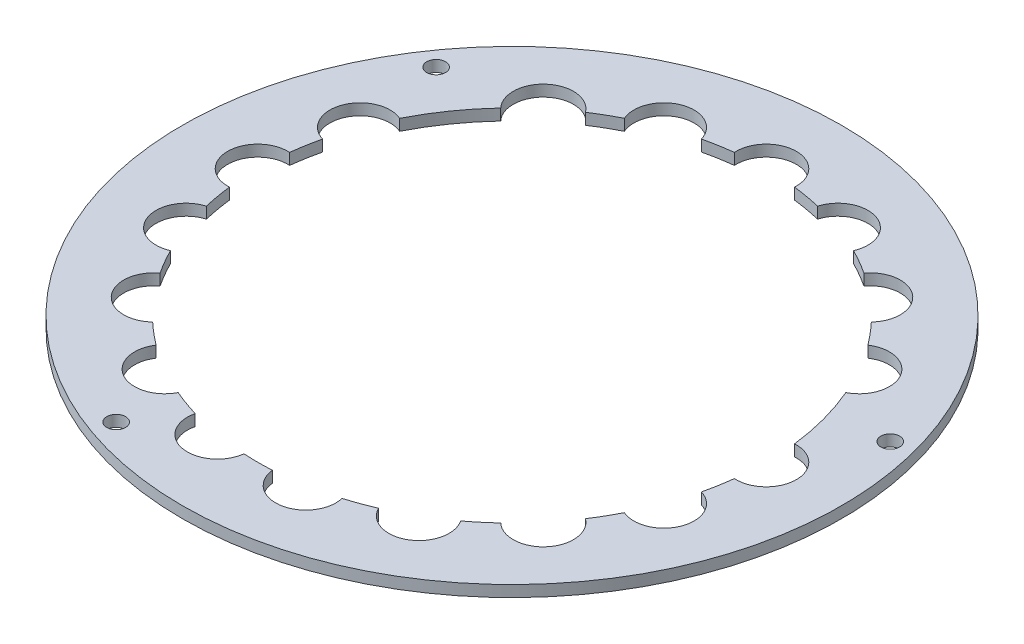
ISO-10303-21;
HEADER;
FILE_DESCRIPTION(('STEP AP214'),'2;1');
FILE_NAME('part.step','',(''),(''),'','','');
FILE_SCHEMA(('AUTOMOTIVE_DESIGN { 1 0 10303 214 1 1 1 1 }'));
ENDSEC;
DATA;
#1=APPLICATION_CONTEXT('core data for automotive mechanical design processes');
#2=APPLICATION_PROTOCOL_DEFINITION('international standard','automotive_design',2000,#1);
#3=PRODUCT_CONTEXT('',#1,'mechanical');
#4=PRODUCT('Part','Part','',(#3));
#5=PRODUCT_RELATED_PRODUCT_CATEGORY('part','',(#4));
#6=PRODUCT_DEFINITION_FORMATION('','',#4);
#7=PRODUCT_DEFINITION_CONTEXT('part definition',#1,'design');
#8=PRODUCT_DEFINITION('design','',#6,#7);
#9=PRODUCT_DEFINITION_SHAPE('','',#8);
#10=(LENGTH_UNIT() NAMED_UNIT(*) SI_UNIT(.MILLI.,.METRE.));
#11=(NAMED_UNIT(*) PLANE_ANGLE_UNIT() SI_UNIT($,.RADIAN.));
#12=(NAMED_UNIT(*) SI_UNIT($,.STERADIAN.) SOLID_ANGLE_UNIT());
#13=UNCERTAINTY_MEASURE_WITH_UNIT(LENGTH_MEASURE(1.E-05),#10,'distance_accuracy_value','');
#14=(GEOMETRIC_REPRESENTATION_CONTEXT(3) GLOBAL_UNCERTAINTY_ASSIGNED_CONTEXT((#13)) GLOBAL_UNIT_ASSIGNED_CONTEXT((#10,
#11,#12)) REPRESENTATION_CONTEXT('',''));
#15=CARTESIAN_POINT('',(0.,0.,0.));
#16=DIRECTION('',(0.,0.,1.));
#17=DIRECTION('',(1.,0.,0.));
#18=AXIS2_PLACEMENT_3D('',#15,#16,#17);
#19=CARTESIAN_POINT('',(0.,-0.00100000000000002,0.));
#20=DIRECTION('',(0.,1.,0.));
#21=DIRECTION('',(0.,0.,1.));
#22=AXIS2_PLACEMENT_3D('',#19,#20,#21);
#23=CYLINDRICAL_SURFACE('',#22,13.5);
#24=CARTESIAN_POINT('',(0.,0.,0.));
#25=DIRECTION('',(0.,1.,0.));
#26=DIRECTION('',(0.,0.,1.));
#27=AXIS2_PLACEMENT_3D('',#24,#25,#26);
#28=CIRCLE('',#27,13.5);
#29=CARTESIAN_POINT('',(-13.4051851851852,0.,-1.59718820146269));
#30=VERTEX_POINT('',#29);
#31=CARTESIAN_POINT('',(-13.1430241363694,0.,-3.08397739142346));
#32=VERTEX_POINT('',#31);
#33=EDGE_CURVE('E269',#30,#32,#28,.F.);
#34=ORIENTED_EDGE('',*,*,#33,.T.);
#35=DIRECTION('',(0.,1.,0.));
#36=VECTOR('',#35,1.);
#37=CARTESIAN_POINT('',(-13.1430241363694,0.3,-3.08397739142346));
#38=LINE('',#37,#36);
#39=CARTESIAN_POINT('',(-13.1430241363694,0.6,-3.08397739142346));
#40=VERTEX_POINT('',#39);
#41=EDGE_CURVE('E49',#40,#32,#38,.F.);
#42=ORIENTED_EDGE('',*,*,#41,.F.);
#43=CARTESIAN_POINT('',(0.,0.6,0.));
#44=DIRECTION('',(0.,1.,0.));
#45=DIRECTION('',(0.,0.,1.));
#46=AXIS2_PLACEMENT_3D('',#43,#44,#45);
#47=CIRCLE('',#46,13.5);
#48=CARTESIAN_POINT('',(-13.4051851851852,0.6,-1.5971882014627));
#49=VERTEX_POINT('',#48);
#50=EDGE_CURVE('E266',#40,#49,#47,.T.);
#51=ORIENTED_EDGE('',*,*,#50,.T.);
#52=DIRECTION('',(0.,1.,0.));
#53=VECTOR('',#52,1.);
#54=CARTESIAN_POINT('',(-13.4051851851852,0.3,-1.5971882014627));
#55=LINE('',#54,#53);
#56=EDGE_CURVE('E553',#30,#49,#55,.T.);
#57=ORIENTED_EDGE('',*,*,#56,.F.);
#58=EDGE_LOOP('',(#34,#42,#51,#57));
#59=FACE_BOUND('',#58,.T.);
#60=ADVANCED_FACE('F34',(#59),#23,.F.);
#61=CARTESIAN_POINT('',(-13.1430241363695,0.,3.08397739142328));
#62=VERTEX_POINT('',#61);
#63=CARTESIAN_POINT('',(-13.4051851851852,0.,1.59718820146269));
#64=VERTEX_POINT('',#63);
#65=EDGE_CURVE('E540',#62,#64,#28,.F.);
#66=ORIENTED_EDGE('',*,*,#65,.T.);
#67=DIRECTION('',(0.,1.,0.));
#68=VECTOR('',#67,1.);
#69=CARTESIAN_POINT('',(-13.4051851851852,0.3,1.5971882014627));
#70=LINE('',#69,#68);
#71=CARTESIAN_POINT('',(-13.4051851851852,0.6,1.5971882014627));
#72=VERTEX_POINT('',#71);
#73=EDGE_CURVE('E57',#72,#64,#70,.F.);
#74=ORIENTED_EDGE('',*,*,#73,.F.);
#75=CARTESIAN_POINT('',(-13.1430241363695,0.6,3.08397739142328));
#76=VERTEX_POINT('',#75);
#77=EDGE_CURVE('E278',#72,#76,#47,.T.);
#78=ORIENTED_EDGE('',*,*,#77,.T.);
#79=DIRECTION('',(0.,1.,0.));
#80=VECTOR('',#79,1.);
#81=CARTESIAN_POINT('',(-13.1430241363695,0.3,3.08397739142328));
#82=LINE('',#81,#80);
#83=EDGE_CURVE('E547',#62,#76,#82,.T.);
#84=ORIENTED_EDGE('',*,*,#83,.F.);
#85=EDGE_LOOP('',(#66,#74,#78,#84));
#86=FACE_BOUND('',#85,.T.);
#87=ADVANCED_FACE('F545',(#86),#23,.F.);
#88=CARTESIAN_POINT('',(-11.2956204063297,0.,7.39316979624485));
#89=VERTEX_POINT('',#88);
#90=CARTESIAN_POINT('',(-12.0504830612048,0.,6.0857093252649));
#91=VERTEX_POINT('',#90);
#92=EDGE_CURVE('E538',#89,#91,#28,.F.);
#93=ORIENTED_EDGE('',*,*,#92,.T.);
#94=DIRECTION('',(0.,1.,0.));
#95=VECTOR('',#94,1.);
#96=CARTESIAN_POINT('',(-12.0504830612048,0.3,6.08570932526491));
#97=LINE('',#96,#95);
#98=CARTESIAN_POINT('',(-12.0504830612048,0.6,6.08570932526491));
#99=VERTEX_POINT('',#98);
#100=EDGE_CURVE('E434',#99,#91,#97,.F.);
#101=ORIENTED_EDGE('',*,*,#100,.F.);
#102=CARTESIAN_POINT('',(-11.2956204063297,0.6,7.39316979624484));
#103=VERTEX_POINT('',#102);
#104=EDGE_CURVE('E283',#99,#103,#47,.T.);
#105=ORIENTED_EDGE('',*,*,#104,.T.);
#106=DIRECTION('',(0.,1.,0.));
#107=VECTOR('',#106,1.);
#108=CARTESIAN_POINT('',(-11.2956204063297,0.3,7.39316979624484));
#109=LINE('',#108,#107);
#110=EDGE_CURVE('E432',#89,#103,#109,.T.);
#111=ORIENTED_EDGE('',*,*,#110,.F.);
#112=EDGE_LOOP('',(#93,#101,#105,#111));
#113=FACE_BOUND('',#112,.T.);
#114=ADVANCED_FACE('F431',(#113),#23,.F.);
#115=CARTESIAN_POINT('',(-8.08579814968411,0.,10.8106368120738));
#116=VERTEX_POINT('',#115);
#117=CARTESIAN_POINT('',(-9.24231483385427,0.,9.84020408893623));
#118=VERTEX_POINT('',#117);
#119=EDGE_CURVE('E535',#116,#118,#28,.F.);
#120=ORIENTED_EDGE('',*,*,#119,.T.);
#121=DIRECTION('',(0.,1.,0.));
#122=VECTOR('',#121,1.);
#123=CARTESIAN_POINT('',(-9.24231483385426,0.3,9.84020408893624));
#124=LINE('',#123,#122);
#125=CARTESIAN_POINT('',(-9.24231483385426,0.6,9.84020408893624));
#126=VERTEX_POINT('',#125);
#127=EDGE_CURVE('E442',#126,#118,#124,.F.);
#128=ORIENTED_EDGE('',*,*,#127,.F.);
#129=CARTESIAN_POINT('',(-8.08579814968412,0.6,10.8106368120738));
#130=VERTEX_POINT('',#129);
#131=EDGE_CURVE('E414',#126,#130,#47,.T.);
#132=ORIENTED_EDGE('',*,*,#131,.T.);
#133=DIRECTION('',(0.,1.,0.));
#134=VECTOR('',#133,1.);
#135=CARTESIAN_POINT('',(-8.08579814968411,0.3,10.8106368120738));
#136=LINE('',#135,#134);
#137=EDGE_CURVE('E451',#116,#130,#136,.T.);
#138=ORIENTED_EDGE('',*,*,#137,.F.);
#139=EDGE_LOOP('',(#120,#128,#132,#138));
#140=FACE_BOUND('',#139,.T.);
#141=ADVANCED_FACE('F564',(#140),#23,.F.);
#142=CARTESIAN_POINT('',(-3.90070930251527,0.,12.9241814803596));
#143=VERTEX_POINT('',#142);
#144=CARTESIAN_POINT('',(-5.31938703550118,0.,12.4078250135365));
#145=VERTEX_POINT('',#144);
#146=EDGE_CURVE('E532',#143,#145,#28,.F.);
#147=ORIENTED_EDGE('',*,*,#146,.T.);
#148=DIRECTION('',(0.,1.,0.));
#149=VECTOR('',#148,1.);
#150=CARTESIAN_POINT('',(-5.31938703550118,0.3,12.4078250135365));
#151=LINE('',#150,#149);
#152=CARTESIAN_POINT('',(-5.31938703550118,0.6,12.4078250135365));
#153=VERTEX_POINT('',#152);
#154=EDGE_CURVE('E446',#153,#145,#151,.F.);
#155=ORIENTED_EDGE('',*,*,#154,.F.);
#156=CARTESIAN_POINT('',(-3.90070930251527,0.6,12.9241814803596));
#157=VERTEX_POINT('',#156);
#158=EDGE_CURVE('E408',#153,#157,#47,.T.);
#159=ORIENTED_EDGE('',*,*,#158,.T.);
#160=DIRECTION('',(0.,1.,0.));
#161=VECTOR('',#160,1.);
#162=CARTESIAN_POINT('',(-3.90070930251527,0.3,12.9241814803596));
#163=LINE('',#162,#161);
#164=EDGE_CURVE('E459',#143,#157,#163,.T.);
#165=ORIENTED_EDGE('',*,*,#164,.F.);
#166=EDGE_LOOP('',(#147,#155,#159,#165));
#167=FACE_BOUND('',#166,.T.);
#168=ADVANCED_FACE('F566',(#167),#23,.F.);
#169=CARTESIAN_POINT('',(0.754862654875016,0.,13.4788791215099));
#170=VERTEX_POINT('',#169);
#171=CARTESIAN_POINT('',(-0.754862654875107,0.,13.4788791215099));
#172=VERTEX_POINT('',#171);
#173=EDGE_CURVE('E529',#170,#172,#28,.F.);
#174=ORIENTED_EDGE('',*,*,#173,.T.);
#175=DIRECTION('',(0.,1.,0.));
#176=VECTOR('',#175,1.);
#177=CARTESIAN_POINT('',(-0.754862654875103,0.3,13.4788791215099));
#178=LINE('',#177,#176);
#179=CARTESIAN_POINT('',(-0.754862654875103,0.6,13.4788791215099));
#180=VERTEX_POINT('',#179);
#181=EDGE_CURVE('E457',#180,#172,#178,.F.);
#182=ORIENTED_EDGE('',*,*,#181,.F.);
#183=CARTESIAN_POINT('',(0.754862654875012,0.6,13.4788791215099));
#184=VERTEX_POINT('',#183);
#185=EDGE_CURVE('E402',#180,#184,#47,.T.);
#186=ORIENTED_EDGE('',*,*,#185,.T.);
#187=DIRECTION('',(0.,1.,0.));
#188=VECTOR('',#187,1.);
#189=CARTESIAN_POINT('',(0.754862654875012,0.3,13.4788791215099));
#190=LINE('',#189,#188);
#191=EDGE_CURVE('E467',#170,#184,#190,.T.);
#192=ORIENTED_EDGE('',*,*,#191,.F.);
#193=EDGE_LOOP('',(#174,#182,#186,#192));
#194=FACE_BOUND('',#193,.T.);
#195=ADVANCED_FACE('F572',(#194),#23,.F.);
#196=CARTESIAN_POINT('',(5.3193870355011,0.,12.4078250135365));
#197=VERTEX_POINT('',#196);
#198=CARTESIAN_POINT('',(3.90070930251518,0.,12.9241814803597));
#199=VERTEX_POINT('',#198);
#200=EDGE_CURVE('E526',#197,#199,#28,.F.);
#201=ORIENTED_EDGE('',*,*,#200,.T.);
#202=DIRECTION('',(0.,1.,0.));
#203=VECTOR('',#202,1.);
#204=CARTESIAN_POINT('',(3.90070930251519,0.3,12.9241814803597));
#205=LINE('',#204,#203);
#206=CARTESIAN_POINT('',(3.90070930251519,0.6,12.9241814803597));
#207=VERTEX_POINT('',#206);
#208=EDGE_CURVE('E465',#207,#199,#205,.F.);
#209=ORIENTED_EDGE('',*,*,#208,.F.);
#210=CARTESIAN_POINT('',(5.31938703550109,0.6,12.4078250135365));
#211=VERTEX_POINT('',#210);
#212=EDGE_CURVE('E396',#207,#211,#47,.T.);
#213=ORIENTED_EDGE('',*,*,#212,.T.);
#214=DIRECTION('',(0.,1.,0.));
#215=VECTOR('',#214,1.);
#216=CARTESIAN_POINT('',(5.31938703550109,0.3,12.4078250135365));
#217=LINE('',#216,#215);
#218=EDGE_CURVE('E475',#197,#211,#217,.T.);
#219=ORIENTED_EDGE('',*,*,#218,.F.);
#220=EDGE_LOOP('',(#201,#209,#213,#219));
#221=FACE_BOUND('',#220,.T.);
#222=ADVANCED_FACE('F700',(#221),#23,.F.);
#223=CARTESIAN_POINT('',(9.2423148338542,0.,9.8402040889363));
#224=VERTEX_POINT('',#223);
#225=CARTESIAN_POINT('',(8.08579814968404,0.,10.8106368120738));
#226=VERTEX_POINT('',#225);
#227=EDGE_CURVE('E523',#224,#226,#28,.F.);
#228=ORIENTED_EDGE('',*,*,#227,.T.);
#229=DIRECTION('',(0.,1.,0.));
#230=VECTOR('',#229,1.);
#231=CARTESIAN_POINT('',(8.08579814968404,0.3,10.8106368120738));
#232=LINE('',#231,#230);
#233=CARTESIAN_POINT('',(8.08579814968404,0.6,10.8106368120738));
#234=VERTEX_POINT('',#233);
#235=EDGE_CURVE('E473',#234,#226,#232,.F.);
#236=ORIENTED_EDGE('',*,*,#235,.F.);
#237=CARTESIAN_POINT('',(9.2423148338542,0.6,9.8402040889363));
#238=VERTEX_POINT('',#237);
#239=EDGE_CURVE('E390',#234,#238,#47,.T.);
#240=ORIENTED_EDGE('',*,*,#239,.T.);
#241=DIRECTION('',(0.,1.,0.));
#242=VECTOR('',#241,1.);
#243=CARTESIAN_POINT('',(9.2423148338542,0.3,9.8402040889363));
#244=LINE('',#243,#242);
#245=EDGE_CURVE('E483',#224,#238,#244,.T.);
#246=ORIENTED_EDGE('',*,*,#245,.F.);
#247=EDGE_LOOP('',(#228,#236,#240,#246));
#248=FACE_BOUND('',#247,.T.);
#249=ADVANCED_FACE('F696',(#248),#23,.F.);
#250=CARTESIAN_POINT('',(12.0504830612048,0.,6.08570932526499));
#251=VERTEX_POINT('',#250);
#252=CARTESIAN_POINT('',(11.2956204063297,0.,7.39316979624492));
#253=VERTEX_POINT('',#252);
#254=EDGE_CURVE('E519',#251,#253,#28,.F.);
#255=ORIENTED_EDGE('',*,*,#254,.T.);
#256=DIRECTION('',(0.,1.,0.));
#257=VECTOR('',#256,1.);
#258=CARTESIAN_POINT('',(11.2956204063297,0.3,7.39316979624492));
#259=LINE('',#258,#257);
#260=CARTESIAN_POINT('',(11.2956204063297,0.6,7.39316979624492));
#261=VERTEX_POINT('',#260);
#262=EDGE_CURVE('E481',#261,#253,#259,.F.);
#263=ORIENTED_EDGE('',*,*,#262,.F.);
#264=CARTESIAN_POINT('',(12.0504830612048,0.6,6.08570932526499));
#265=VERTEX_POINT('',#264);
#266=EDGE_CURVE('E384',#261,#265,#47,.T.);
#267=ORIENTED_EDGE('',*,*,#266,.T.);
#268=DIRECTION('',(0.,1.,0.));
#269=VECTOR('',#268,1.);
#270=CARTESIAN_POINT('',(12.0504830612048,0.3,6.08570932526499));
#271=LINE('',#270,#269);
#272=EDGE_CURVE('E491',#251,#265,#271,.T.);
#273=ORIENTED_EDGE('',*,*,#272,.F.);
#274=EDGE_LOOP('',(#255,#263,#267,#273));
#275=FACE_BOUND('',#274,.T.);
#276=ADVANCED_FACE('F692',(#275),#23,.F.);
#277=CARTESIAN_POINT('',(13.4051851851852,0.,1.59718820146269));
#278=VERTEX_POINT('',#277);
#279=CARTESIAN_POINT('',(13.1430241363694,0.,3.08397739142337));
#280=VERTEX_POINT('',#279);
#281=EDGE_CURVE('E516',#278,#280,#28,.F.);
#282=ORIENTED_EDGE('',*,*,#281,.T.);
#283=DIRECTION('',(0.,1.,0.));
#284=VECTOR('',#283,1.);
#285=CARTESIAN_POINT('',(13.1430241363694,0.3,3.08397739142337));
#286=LINE('',#285,#284);
#287=CARTESIAN_POINT('',(13.1430241363694,0.6,3.08397739142337));
#288=VERTEX_POINT('',#287);
#289=EDGE_CURVE('E489',#288,#280,#286,.F.);
#290=ORIENTED_EDGE('',*,*,#289,.F.);
#291=CARTESIAN_POINT('',(13.4051851851852,0.6,1.5971882014627));
#292=VERTEX_POINT('',#291);
#293=EDGE_CURVE('E380',#288,#292,#47,.T.);
#294=ORIENTED_EDGE('',*,*,#293,.T.);
#295=DIRECTION('',(0.,1.,0.));
#296=VECTOR('',#295,1.);
#297=CARTESIAN_POINT('',(13.4051851851852,0.3,1.5971882014627));
#298=LINE('',#297,#296);
#299=EDGE_CURVE('E499',#278,#292,#298,.T.);
#300=ORIENTED_EDGE('',*,*,#299,.F.);
#301=EDGE_LOOP('',(#282,#290,#294,#300));
#302=FACE_BOUND('',#301,.T.);
#303=ADVANCED_FACE('F611',(#302),#23,.F.);
#304=CARTESIAN_POINT('',(12.4078250135365,0.,-5.31938703550114));
#305=VERTEX_POINT('',#304);
#306=CARTESIAN_POINT('',(13.4051851851852,0.,-1.59718820146269));
#307=VERTEX_POINT('',#306);
#308=EDGE_CURVE('E294',#305,#307,#28,.F.);
#309=ORIENTED_EDGE('',*,*,#308,.T.);
#310=DIRECTION('',(0.,1.,0.));
#311=VECTOR('',#310,1.);
#312=CARTESIAN_POINT('',(13.4051851851852,0.3,-1.5971882014627));
#313=LINE('',#312,#311);
#314=CARTESIAN_POINT('',(13.4051851851852,0.6,-1.5971882014627));
#315=VERTEX_POINT('',#314);
#316=EDGE_CURVE('E497',#315,#307,#313,.F.);
#317=ORIENTED_EDGE('',*,*,#316,.F.);
#318=CARTESIAN_POINT('',(12.4078250135365,0.6,-5.31938703550114));
#319=VERTEX_POINT('',#318);
#320=EDGE_CURVE('E282',#315,#319,#47,.T.);
#321=ORIENTED_EDGE('',*,*,#320,.T.);
#322=DIRECTION('',(0.,1.,0.));
#323=VECTOR('',#322,1.);
#324=CARTESIAN_POINT('',(12.4078250135365,0.3,-5.31938703550114));
#325=LINE('',#324,#323);
#326=EDGE_CURVE('E372',#305,#319,#325,.T.);
#327=ORIENTED_EDGE('',*,*,#326,.F.);
#328=EDGE_LOOP('',(#309,#317,#321,#327));
#329=FACE_BOUND('',#328,.T.);
#330=ADVANCED_FACE('F607',(#329),#23,.F.);
#331=CARTESIAN_POINT('',(-9.84020408893633,0.6,-9.24231483385416));
#332=VERTEX_POINT('',#331);
#333=CARTESIAN_POINT('',(-12.0504830612047,0.6,-6.08570932526507));
#334=VERTEX_POINT('',#333);
#335=EDGE_CURVE('E277',#332,#334,#47,.T.);
#336=ORIENTED_EDGE('',*,*,#335,.T.);
#337=DIRECTION('',(0.,1.,0.));
#338=VECTOR('',#337,1.);
#339=CARTESIAN_POINT('',(-12.0504830612047,0.3,-6.08570932526507));
#340=LINE('',#339,#338);
#341=CARTESIAN_POINT('',(-12.0504830612047,0.,-6.08570932526507));
#342=VERTEX_POINT('',#341);
#343=EDGE_CURVE('E256',#342,#334,#340,.T.);
#344=ORIENTED_EDGE('',*,*,#343,.F.);
#345=CARTESIAN_POINT('',(-9.84020408893633,0.,-9.24231483385416));
#346=VERTEX_POINT('',#345);
#347=EDGE_CURVE('E511',#342,#346,#28,.F.);
#348=ORIENTED_EDGE('',*,*,#347,.T.);
#349=DIRECTION('',(0.,1.,0.));
#350=VECTOR('',#349,1.);
#351=CARTESIAN_POINT('',(-9.84020408893633,0.3,-9.24231483385416));
#352=LINE('',#351,#350);
#353=EDGE_CURVE('E332',#332,#346,#352,.F.);
#354=ORIENTED_EDGE('',*,*,#353,.F.);
#355=EDGE_LOOP('',(#336,#344,#348,#354));
#356=FACE_BOUND('',#355,.T.);
#357=ADVANCED_FACE('F603',(#356),#23,.F.);
#358=CARTESIAN_POINT('',(-6.08570932526503,0.6,-12.0504830612047));
#359=VERTEX_POINT('',#358);
#360=CARTESIAN_POINT('',(-7.39316979624496,0.6,-11.2956204063297));
#361=VERTEX_POINT('',#360);
#362=EDGE_CURVE('E281',#359,#361,#47,.T.);
#363=ORIENTED_EDGE('',*,*,#362,.T.);
#364=DIRECTION('',(0.,1.,0.));
#365=VECTOR('',#364,1.);
#366=CARTESIAN_POINT('',(-7.39316979624496,0.3,-11.2956204063297));
#367=LINE('',#366,#365);
#368=CARTESIAN_POINT('',(-7.39316979624496,0.,-11.2956204063297));
#369=VERTEX_POINT('',#368);
#370=EDGE_CURVE('E318',#369,#361,#367,.T.);
#371=ORIENTED_EDGE('',*,*,#370,.F.);
#372=CARTESIAN_POINT('',(-6.08570932526503,0.,-12.0504830612047));
#373=VERTEX_POINT('',#372);
#374=EDGE_CURVE('E513',#369,#373,#28,.F.);
#375=ORIENTED_EDGE('',*,*,#374,.T.);
#376=DIRECTION('',(0.,1.,0.));
#377=VECTOR('',#376,1.);
#378=CARTESIAN_POINT('',(-6.08570932526503,0.3,-12.0504830612047));
#379=LINE('',#378,#377);
#380=EDGE_CURVE('E321',#359,#373,#379,.F.);
#381=ORIENTED_EDGE('',*,*,#380,.F.);
#382=EDGE_LOOP('',(#363,#371,#375,#381));
#383=FACE_BOUND('',#382,.T.);
#384=ADVANCED_FACE('F317',(#383),#23,.F.);
#385=CARTESIAN_POINT('',(-1.59718820146275,0.6,-13.4051851851852));
#386=VERTEX_POINT('',#385);
#387=CARTESIAN_POINT('',(-3.08397739142342,0.6,-13.1430241363694));
#388=VERTEX_POINT('',#387);
#389=EDGE_CURVE('E302',#386,#388,#47,.T.);
#390=ORIENTED_EDGE('',*,*,#389,.T.);
#391=DIRECTION('',(0.,1.,0.));
#392=VECTOR('',#391,1.);
#393=CARTESIAN_POINT('',(-3.08397739142342,0.3,-13.1430241363694));
#394=LINE('',#393,#392);
#395=CARTESIAN_POINT('',(-3.08397739142342,0.,-13.1430241363694));
#396=VERTEX_POINT('',#395);
#397=EDGE_CURVE('E337',#396,#388,#394,.T.);
#398=ORIENTED_EDGE('',*,*,#397,.F.);
#399=CARTESIAN_POINT('',(-1.59718820146274,0.,-13.4051851851852));
#400=VERTEX_POINT('',#399);
#401=EDGE_CURVE('E515',#396,#400,#28,.F.);
#402=ORIENTED_EDGE('',*,*,#401,.T.);
#403=DIRECTION('',(0.,1.,0.));
#404=VECTOR('',#403,1.);
#405=CARTESIAN_POINT('',(-1.59718820146275,0.3,-13.4051851851852));
#406=LINE('',#405,#404);
#407=EDGE_CURVE('E342',#386,#400,#406,.F.);
#408=ORIENTED_EDGE('',*,*,#407,.F.);
#409=EDGE_LOOP('',(#390,#398,#402,#408));
#410=FACE_BOUND('',#409,.T.);
#411=ADVANCED_FACE('F596',(#410),#23,.F.);
#412=CARTESIAN_POINT('',(3.08397739142332,0.6,-13.1430241363694));
#413=VERTEX_POINT('',#412);
#414=CARTESIAN_POINT('',(1.59718820146264,0.6,-13.4051851851852));
#415=VERTEX_POINT('',#414);
#416=EDGE_CURVE('E296',#413,#415,#47,.T.);
#417=ORIENTED_EDGE('',*,*,#416,.T.);
#418=DIRECTION('',(0.,1.,0.));
#419=VECTOR('',#418,1.);
#420=CARTESIAN_POINT('',(1.59718820146264,0.3,-13.4051851851852));
#421=LINE('',#420,#419);
#422=CARTESIAN_POINT('',(1.59718820146264,0.,-13.4051851851852));
#423=VERTEX_POINT('',#422);
#424=EDGE_CURVE('E345',#423,#415,#421,.T.);
#425=ORIENTED_EDGE('',*,*,#424,.F.);
#426=CARTESIAN_POINT('',(3.08397739142332,0.,-13.1430241363694));
#427=VERTEX_POINT('',#426);
#428=EDGE_CURVE('E517',#423,#427,#28,.F.);
#429=ORIENTED_EDGE('',*,*,#428,.T.);
#430=DIRECTION('',(0.,1.,0.));
#431=VECTOR('',#430,1.);
#432=CARTESIAN_POINT('',(3.08397739142332,0.3,-13.1430241363694));
#433=LINE('',#432,#431);
#434=EDGE_CURVE('E351',#413,#427,#433,.F.);
#435=ORIENTED_EDGE('',*,*,#434,.F.);
#436=EDGE_LOOP('',(#417,#425,#429,#435));
#437=FACE_BOUND('',#436,.T.);
#438=ADVANCED_FACE('F590',(#437),#23,.F.);
#439=CARTESIAN_POINT('',(7.39316979624488,0.6,-11.2956204063297));
#440=VERTEX_POINT('',#439);
#441=CARTESIAN_POINT('',(6.08570932526494,0.6,-12.0504830612048));
#442=VERTEX_POINT('',#441);
#443=EDGE_CURVE('E288',#440,#442,#47,.T.);
#444=ORIENTED_EDGE('',*,*,#443,.T.);
#445=DIRECTION('',(0.,1.,0.));
#446=VECTOR('',#445,1.);
#447=CARTESIAN_POINT('',(6.08570932526494,0.3,-12.0504830612048));
#448=LINE('',#447,#446);
#449=CARTESIAN_POINT('',(6.08570932526494,0.,-12.0504830612048));
#450=VERTEX_POINT('',#449);
#451=EDGE_CURVE('E354',#450,#442,#448,.T.);
#452=ORIENTED_EDGE('',*,*,#451,.F.);
#453=CARTESIAN_POINT('',(7.39316979624487,0.,-11.2956204063297));
#454=VERTEX_POINT('',#453);
#455=EDGE_CURVE('E293',#450,#454,#28,.F.);
#456=ORIENTED_EDGE('',*,*,#455,.T.);
#457=DIRECTION('',(0.,1.,0.));
#458=VECTOR('',#457,1.);
#459=CARTESIAN_POINT('',(7.39316979624488,0.3,-11.2956204063297));
#460=LINE('',#459,#458);
#461=EDGE_CURVE('E360',#440,#454,#460,.F.);
#462=ORIENTED_EDGE('',*,*,#461,.F.);
#463=EDGE_LOOP('',(#444,#452,#456,#462));
#464=FACE_BOUND('',#463,.T.);
#465=ADVANCED_FACE('F582',(#464),#23,.F.);
#466=CARTESIAN_POINT('',(0.,0.6,0.));
#467=DIRECTION('',(0.,-1.,0.));
#468=DIRECTION('',(0.,0.,-1.));
#469=AXIS2_PLACEMENT_3D('',#466,#467,#468);
#470=CYLINDRICAL_SURFACE('',#469,17.5);
#471=CARTESIAN_POINT('',(0.,0.6,0.));
#472=DIRECTION('',(0.,1.,0.));
#473=DIRECTION('',(0.,0.,1.));
#474=AXIS2_PLACEMENT_3D('',#471,#472,#473);
#475=CIRCLE('',#474,17.5);
#476=CARTESIAN_POINT('',(0.,0.6,17.5));
#477=VERTEX_POINT('',#476);
#478=EDGE_CURVE('E11',#477,#477,#475,.T.);
#479=ORIENTED_EDGE('',*,*,#478,.F.);
#480=EDGE_LOOP('',(#479));
#481=FACE_BOUND('',#480,.T.);
#482=CARTESIAN_POINT('',(0.,0.,0.));
#483=DIRECTION('',(0.,1.,0.));
#484=DIRECTION('',(0.,0.,1.));
#485=AXIS2_PLACEMENT_3D('',#482,#483,#484);
#486=CIRCLE('',#485,17.5);
#487=CARTESIAN_POINT('',(0.,0.,17.5));
#488=VERTEX_POINT('',#487);
#489=EDGE_CURVE('E38',#488,#488,#486,.T.);
#490=ORIENTED_EDGE('',*,*,#489,.T.);
#491=EDGE_LOOP('',(#490));
#492=FACE_BOUND('',#491,.T.);
#493=ADVANCED_FACE('F36',(#481,#492),#470,.T.);
#494=CARTESIAN_POINT('',(0.,0.6,0.));
#495=DIRECTION('',(0.,1.,0.));
#496=DIRECTION('',(0.,0.,1.));
#497=AXIS2_PLACEMENT_3D('',#494,#495,#496);
#498=PLANE('',#497);
#499=CARTESIAN_POINT('',(15.8411835511407,0.6,-4.24463233968135));
#500=DIRECTION('',(0.,1.,0.));
#501=DIRECTION('',(0.,0.,1.));
#502=AXIS2_PLACEMENT_3D('',#499,#500,#501);
#503=CIRCLE('',#502,0.5);
#504=CARTESIAN_POINT('',(15.8411835511407,0.6,-3.74463233968135));
#505=VERTEX_POINT('',#504);
#506=EDGE_CURVE('E860',#505,#505,#503,.T.);
#507=ORIENTED_EDGE('',*,*,#506,.F.);
#508=EDGE_LOOP('',(#507));
#509=FACE_BOUND('',#508,.T.);
#510=CARTESIAN_POINT('',(-13.4340935263395,0.6,-9.40665355615707));
#511=DIRECTION('',(0.,1.,0.));
#512=DIRECTION('',(0.,0.,1.));
#513=AXIS2_PLACEMENT_3D('',#510,#511,#512);
#514=CIRCLE('',#513,0.5);
#515=CARTESIAN_POINT('',(-13.4340935263395,0.6,-8.90665355615707));
#516=VERTEX_POINT('',#515);
#517=EDGE_CURVE('E862',#516,#516,#514,.T.);
#518=ORIENTED_EDGE('',*,*,#517,.F.);
#519=EDGE_LOOP('',(#518));
#520=FACE_BOUND('',#519,.T.);
#521=CARTESIAN_POINT('',(-5.60913035054103,0.6,15.4109589808889));
#522=DIRECTION('',(0.,1.,0.));
#523=DIRECTION('',(0.,0.,1.));
#524=AXIS2_PLACEMENT_3D('',#521,#522,#523);
#525=CIRCLE('',#524,0.5);
#526=CARTESIAN_POINT('',(-5.60913035054103,0.6,15.9109589808889));
#527=VERTEX_POINT('',#526);
#528=EDGE_CURVE('E870',#527,#527,#525,.T.);
#529=ORIENTED_EDGE('',*,*,#528,.F.);
#530=EDGE_LOOP('',(#529));
#531=FACE_BOUND('',#530,.T.);
#532=CARTESIAN_POINT('',(-12.6858503806097,0.6,-4.61727193489662));
#533=DIRECTION('',(0.,1.,0.));
#534=DIRECTION('',(0.342020143325676,0.,-0.939692620785906));
#535=AXIS2_PLACEMENT_3D('',#532,#533,#534);
#536=CIRCLE('',#535,1.6);
#537=EDGE_CURVE('E253',#334,#40,#536,.T.);
#538=ORIENTED_EDGE('',*,*,#537,.F.);
#539=ORIENTED_EDGE('',*,*,#335,.F.);
#540=CARTESIAN_POINT('',(-8.67763273076834,0.6,-10.3415999821062));
#541=DIRECTION('',(0.,1.,0.));
#542=DIRECTION('',(0.984807753012207,0.,-0.173648177666934));
#543=AXIS2_PLACEMENT_3D('',#540,#541,#542);
#544=CIRCLE('',#543,1.6);
#545=EDGE_CURVE('E325',#361,#332,#544,.T.);
#546=ORIENTED_EDGE('',*,*,#545,.F.);
#547=ORIENTED_EDGE('',*,*,#362,.F.);
#548=CARTESIAN_POINT('',(-4.61727193489658,0.6,-12.6858503806097));
#549=DIRECTION('',(0.,1.,0.));
#550=DIRECTION('',(0.984807753012209,0.,0.173648177666927));
#551=AXIS2_PLACEMENT_3D('',#548,#549,#550);
#552=CIRCLE('',#551,1.6);
#553=EDGE_CURVE('E324',#388,#359,#552,.T.);
#554=ORIENTED_EDGE('',*,*,#553,.F.);
#555=ORIENTED_EDGE('',*,*,#389,.F.);
#556=CARTESIAN_POINT('',(0.,0.6,-13.5));
#557=DIRECTION('',(0.,1.,0.));
#558=DIRECTION('',(0.86602540378444,0.,0.499999999999998));
#559=AXIS2_PLACEMENT_3D('',#556,#557,#558);
#560=CIRCLE('',#559,1.6);
#561=EDGE_CURVE('E347',#415,#386,#560,.T.);
#562=ORIENTED_EDGE('',*,*,#561,.F.);
#563=ORIENTED_EDGE('',*,*,#416,.F.);
#564=CARTESIAN_POINT('',(4.61727193489649,0.6,-12.6858503806098));
#565=DIRECTION('',(0.,1.,0.));
#566=DIRECTION('',(0.642787609686541,0.,0.766044443118977));
#567=AXIS2_PLACEMENT_3D('',#564,#565,#566);
#568=CIRCLE('',#567,1.6);
#569=EDGE_CURVE('E356',#442,#413,#568,.T.);
#570=ORIENTED_EDGE('',*,*,#569,.F.);
#571=ORIENTED_EDGE('',*,*,#443,.F.);
#572=CARTESIAN_POINT('',(8.67763273076826,0.6,-10.3415999821062));
#573=DIRECTION('',(0.,1.,0.));
#574=DIRECTION('',(0.342020143325669,0.,0.939692620785908));
#575=AXIS2_PLACEMENT_3D('',#572,#573,#574);
#576=CIRCLE('',#575,1.6);
#577=CARTESIAN_POINT('',(9.84020408893627,0.6,-9.24231483385423));
#578=VERTEX_POINT('',#577);
#579=EDGE_CURVE('E365',#578,#440,#576,.T.);
#580=ORIENTED_EDGE('',*,*,#579,.F.);
#581=CARTESIAN_POINT('',(10.8106368120738,0.6,-8.08579814968408));
#582=VERTEX_POINT('',#581);
#583=EDGE_CURVE('E280',#582,#578,#47,.T.);
#584=ORIENTED_EDGE('',*,*,#583,.F.);
#585=CARTESIAN_POINT('',(11.6913429510899,0.6,-6.75000000000002));
#586=DIRECTION('',(0.,1.,0.));
#587=DIRECTION('',(0.,0.,1.));
#588=AXIS2_PLACEMENT_3D('',#585,#586,#587);
#589=CIRCLE('',#588,1.6);
#590=EDGE_CURVE('E375',#319,#582,#589,.T.);
#591=ORIENTED_EDGE('',*,*,#590,.F.);
#592=ORIENTED_EDGE('',*,*,#320,.F.);
#593=CARTESIAN_POINT('',(13.5,0.6,0.));
#594=DIRECTION('',(0.,1.,0.));
#595=DIRECTION('',(0.,0.,1.));
#596=AXIS2_PLACEMENT_3D('',#593,#594,#595);
#597=CIRCLE('',#596,1.6);
#598=EDGE_CURVE('E501',#292,#315,#597,.T.);
#599=ORIENTED_EDGE('',*,*,#598,.F.);
#600=ORIENTED_EDGE('',*,*,#293,.F.);
#601=CARTESIAN_POINT('',(12.6858503806098,0.6,4.61727193489654));
#602=DIRECTION('',(0.,1.,0.));
#603=DIRECTION('',(-0.342020143325669,0.,0.939692620785908));
#604=AXIS2_PLACEMENT_3D('',#601,#602,#603);
#605=CIRCLE('',#604,1.6);
#606=EDGE_CURVE('E493',#265,#288,#605,.T.);
#607=ORIENTED_EDGE('',*,*,#606,.F.);
#608=ORIENTED_EDGE('',*,*,#266,.F.);
#609=CARTESIAN_POINT('',(10.3415999821062,0.6,8.6776327307683));
#610=DIRECTION('',(0.,1.,0.));
#611=DIRECTION('',(-0.642787609686541,0.,0.766044443118977));
#612=AXIS2_PLACEMENT_3D('',#609,#610,#611);
#613=CIRCLE('',#612,1.6);
#614=EDGE_CURVE('E485',#238,#261,#613,.T.);
#615=ORIENTED_EDGE('',*,*,#614,.F.);
#616=ORIENTED_EDGE('',*,*,#239,.F.);
#617=CARTESIAN_POINT('',(6.74999999999997,0.6,11.6913429510899));
#618=DIRECTION('',(0.,1.,0.));
#619=DIRECTION('',(-0.86602540378444,0.,0.499999999999998));
#620=AXIS2_PLACEMENT_3D('',#617,#618,#619);
#621=CIRCLE('',#620,1.6);
#622=EDGE_CURVE('E477',#211,#234,#621,.T.);
#623=ORIENTED_EDGE('',*,*,#622,.F.);
#624=ORIENTED_EDGE('',*,*,#212,.F.);
#625=CARTESIAN_POINT('',(2.34425039850352,0.6,13.2949046656648));
#626=DIRECTION('',(0.,1.,0.));
#627=DIRECTION('',(-0.984807753012209,0.,0.173648177666927));
#628=AXIS2_PLACEMENT_3D('',#625,#626,#627);
#629=CIRCLE('',#628,1.6);
#630=EDGE_CURVE('E469',#184,#207,#629,.T.);
#631=ORIENTED_EDGE('',*,*,#630,.F.);
#632=ORIENTED_EDGE('',*,*,#185,.F.);
#633=CARTESIAN_POINT('',(-2.34425039850361,0.6,13.2949046656648));
#634=DIRECTION('',(0.,1.,0.));
#635=DIRECTION('',(-0.984807753012207,0.,-0.173648177666934));
#636=AXIS2_PLACEMENT_3D('',#633,#634,#635);
#637=CIRCLE('',#636,1.6);
#638=EDGE_CURVE('E461',#157,#180,#637,.T.);
#639=ORIENTED_EDGE('',*,*,#638,.F.);
#640=ORIENTED_EDGE('',*,*,#158,.F.);
#641=CARTESIAN_POINT('',(-6.75000000000006,0.6,11.6913429510899));
#642=DIRECTION('',(0.,1.,0.));
#643=DIRECTION('',(-0.866025403784436,0.,-0.500000000000004));
#644=AXIS2_PLACEMENT_3D('',#641,#642,#643);
#645=CIRCLE('',#644,1.6);
#646=EDGE_CURVE('E453',#130,#153,#645,.T.);
#647=ORIENTED_EDGE('',*,*,#646,.F.);
#648=ORIENTED_EDGE('',*,*,#131,.F.);
#649=CARTESIAN_POINT('',(-10.3415999821062,0.6,8.67763273076823));
#650=DIRECTION('',(0.,1.,0.));
#651=DIRECTION('',(-0.642787609686535,0.,-0.766044443118981));
#652=AXIS2_PLACEMENT_3D('',#649,#650,#651);
#653=CIRCLE('',#652,1.6);
#654=EDGE_CURVE('E439',#103,#126,#653,.T.);
#655=ORIENTED_EDGE('',*,*,#654,.F.);
#656=ORIENTED_EDGE('',*,*,#104,.F.);
#657=CARTESIAN_POINT('',(-12.6858503806098,0.6,4.61727193489645));
#658=DIRECTION('',(0.,1.,0.));
#659=DIRECTION('',(-0.342020143325663,0.,-0.939692620785911));
#660=AXIS2_PLACEMENT_3D('',#657,#658,#659);
#661=CIRCLE('',#660,1.6);
#662=EDGE_CURVE('E558',#76,#99,#661,.T.);
#663=ORIENTED_EDGE('',*,*,#662,.F.);
#664=ORIENTED_EDGE('',*,*,#77,.F.);
#665=CARTESIAN_POINT('',(-13.5,0.6,0.));
#666=DIRECTION('',(0.,1.,0.));
#667=DIRECTION('',(0.,0.,-1.));
#668=AXIS2_PLACEMENT_3D('',#665,#666,#667);
#669=CIRCLE('',#668,1.6);
#670=EDGE_CURVE('E276',#49,#72,#669,.T.);
#671=ORIENTED_EDGE('',*,*,#670,.F.);
#672=ORIENTED_EDGE('',*,*,#50,.F.);
#673=EDGE_LOOP('',(#538,#539,#546,#547,#554,#555,#562,#563,#570,#571,#580,#584,#591,#592,#599,
#600,#607,#608,#615,#616,#623,#624,#631,#632,#639,#640,#647,#648,#655,#656,#663,#664,#671,#672));
#674=FACE_BOUND('',#673,.T.);
#675=ORIENTED_EDGE('',*,*,#478,.T.);
#676=EDGE_LOOP('',(#675));
#677=FACE_BOUND('',#676,.T.);
#678=ADVANCED_FACE('F273',(#509,#520,#531,#674,#677),#498,.T.);
#679=CARTESIAN_POINT('',(0.,0.,0.));
#680=DIRECTION('',(0.,1.,0.));
#681=DIRECTION('',(0.,0.,1.));
#682=AXIS2_PLACEMENT_3D('',#679,#680,#681);
#683=PLANE('',#682);
#684=CARTESIAN_POINT('',(15.8411835511407,0.,-4.24463233968135));
#685=DIRECTION('',(0.,1.,0.));
#686=DIRECTION('',(0.,0.,1.));
#687=AXIS2_PLACEMENT_3D('',#684,#685,#686);
#688=CIRCLE('',#687,0.5);
#689=CARTESIAN_POINT('',(15.8411835511407,0.,-3.74463233968135));
#690=VERTEX_POINT('',#689);
#691=EDGE_CURVE('E857',#690,#690,#688,.T.);
#692=ORIENTED_EDGE('',*,*,#691,.T.);
#693=EDGE_LOOP('',(#692));
#694=FACE_BOUND('',#693,.T.);
#695=CARTESIAN_POINT('',(-13.4340935263395,0.,-9.40665355615707));
#696=DIRECTION('',(0.,1.,0.));
#697=DIRECTION('',(0.,0.,1.));
#698=AXIS2_PLACEMENT_3D('',#695,#696,#697);
#699=CIRCLE('',#698,0.5);
#700=CARTESIAN_POINT('',(-13.4340935263395,0.,-8.90665355615707));
#701=VERTEX_POINT('',#700);
#702=EDGE_CURVE('E867',#701,#701,#699,.T.);
#703=ORIENTED_EDGE('',*,*,#702,.T.);
#704=EDGE_LOOP('',(#703));
#705=FACE_BOUND('',#704,.T.);
#706=CARTESIAN_POINT('',(-5.60913035054103,0.,15.4109589808889));
#707=DIRECTION('',(0.,1.,0.));
#708=DIRECTION('',(0.,0.,1.));
#709=AXIS2_PLACEMENT_3D('',#706,#707,#708);
#710=CIRCLE('',#709,0.5);
#711=CARTESIAN_POINT('',(-5.60913035054103,0.,15.9109589808889));
#712=VERTEX_POINT('',#711);
#713=EDGE_CURVE('E270',#712,#712,#710,.T.);
#714=ORIENTED_EDGE('',*,*,#713,.T.);
#715=EDGE_LOOP('',(#714));
#716=FACE_BOUND('',#715,.T.);
#717=ORIENTED_EDGE('',*,*,#347,.F.);
#718=CARTESIAN_POINT('',(-12.6858503806097,0.,-4.61727193489662));
#719=DIRECTION('',(0.,1.,0.));
#720=DIRECTION('',(0.,0.,1.));
#721=AXIS2_PLACEMENT_3D('',#718,#719,#720);
#722=CIRCLE('',#721,1.6);
#723=EDGE_CURVE('E261',#32,#342,#722,.F.);
#724=ORIENTED_EDGE('',*,*,#723,.F.);
#725=ORIENTED_EDGE('',*,*,#33,.F.);
#726=CARTESIAN_POINT('',(-13.5,0.,0.));
#727=DIRECTION('',(0.,1.,0.));
#728=DIRECTION('',(0.,0.,1.));
#729=AXIS2_PLACEMENT_3D('',#726,#727,#728);
#730=CIRCLE('',#729,1.6);
#731=EDGE_CURVE('E550',#64,#30,#730,.F.);
#732=ORIENTED_EDGE('',*,*,#731,.F.);
#733=ORIENTED_EDGE('',*,*,#65,.F.);
#734=CARTESIAN_POINT('',(-12.6858503806098,0.,4.61727193489645));
#735=DIRECTION('',(0.,1.,0.));
#736=DIRECTION('',(0.,0.,1.));
#737=AXIS2_PLACEMENT_3D('',#734,#735,#736);
#738=CIRCLE('',#737,1.6);
#739=EDGE_CURVE('E549',#91,#62,#738,.F.);
#740=ORIENTED_EDGE('',*,*,#739,.F.);
#741=ORIENTED_EDGE('',*,*,#92,.F.);
#742=CARTESIAN_POINT('',(-10.3415999821062,0.,8.67763273076823));
#743=DIRECTION('',(0.,1.,0.));
#744=DIRECTION('',(0.,0.,1.));
#745=AXIS2_PLACEMENT_3D('',#742,#743,#744);
#746=CIRCLE('',#745,1.6);
#747=EDGE_CURVE('E441',#118,#89,#746,.F.);
#748=ORIENTED_EDGE('',*,*,#747,.F.);
#749=ORIENTED_EDGE('',*,*,#119,.F.);
#750=CARTESIAN_POINT('',(-6.75000000000006,0.,11.6913429510899));
#751=DIRECTION('',(0.,1.,0.));
#752=DIRECTION('',(0.,0.,1.));
#753=AXIS2_PLACEMENT_3D('',#750,#751,#752);
#754=CIRCLE('',#753,1.6);
#755=EDGE_CURVE('E455',#145,#116,#754,.F.);
#756=ORIENTED_EDGE('',*,*,#755,.F.);
#757=ORIENTED_EDGE('',*,*,#146,.F.);
#758=CARTESIAN_POINT('',(-2.34425039850361,0.,13.2949046656648));
#759=DIRECTION('',(0.,1.,0.));
#760=DIRECTION('',(0.,0.,1.));
#761=AXIS2_PLACEMENT_3D('',#758,#759,#760);
#762=CIRCLE('',#761,1.6);
#763=EDGE_CURVE('E463',#172,#143,#762,.F.);
#764=ORIENTED_EDGE('',*,*,#763,.F.);
#765=ORIENTED_EDGE('',*,*,#173,.F.);
#766=CARTESIAN_POINT('',(2.34425039850352,0.,13.2949046656648));
#767=DIRECTION('',(0.,1.,0.));
#768=DIRECTION('',(0.,0.,1.));
#769=AXIS2_PLACEMENT_3D('',#766,#767,#768);
#770=CIRCLE('',#769,1.6);
#771=EDGE_CURVE('E471',#199,#170,#770,.F.);
#772=ORIENTED_EDGE('',*,*,#771,.F.);
#773=ORIENTED_EDGE('',*,*,#200,.F.);
#774=CARTESIAN_POINT('',(6.74999999999997,0.,11.6913429510899));
#775=DIRECTION('',(0.,1.,0.));
#776=DIRECTION('',(0.,0.,1.));
#777=AXIS2_PLACEMENT_3D('',#774,#775,#776);
#778=CIRCLE('',#777,1.6);
#779=EDGE_CURVE('E479',#226,#197,#778,.F.);
#780=ORIENTED_EDGE('',*,*,#779,.F.);
#781=ORIENTED_EDGE('',*,*,#227,.F.);
#782=CARTESIAN_POINT('',(10.3415999821062,0.,8.6776327307683));
#783=DIRECTION('',(0.,1.,0.));
#784=DIRECTION('',(0.,0.,1.));
#785=AXIS2_PLACEMENT_3D('',#782,#783,#784);
#786=CIRCLE('',#785,1.6);
#787=EDGE_CURVE('E487',#253,#224,#786,.F.);
#788=ORIENTED_EDGE('',*,*,#787,.F.);
#789=ORIENTED_EDGE('',*,*,#254,.F.);
#790=CARTESIAN_POINT('',(12.6858503806098,0.,4.61727193489654));
#791=DIRECTION('',(0.,1.,0.));
#792=DIRECTION('',(0.,0.,1.));
#793=AXIS2_PLACEMENT_3D('',#790,#791,#792);
#794=CIRCLE('',#793,1.6);
#795=EDGE_CURVE('E495',#280,#251,#794,.F.);
#796=ORIENTED_EDGE('',*,*,#795,.F.);
#797=ORIENTED_EDGE('',*,*,#281,.F.);
#798=CARTESIAN_POINT('',(13.5,0.,0.));
#799=DIRECTION('',(0.,1.,0.));
#800=DIRECTION('',(0.,0.,1.));
#801=AXIS2_PLACEMENT_3D('',#798,#799,#800);
#802=CIRCLE('',#801,1.6);
#803=EDGE_CURVE('E503',#307,#278,#802,.F.);
#804=ORIENTED_EDGE('',*,*,#803,.F.);
#805=ORIENTED_EDGE('',*,*,#308,.F.);
#806=CARTESIAN_POINT('',(11.6913429510899,0.,-6.75000000000002));
#807=DIRECTION('',(0.,1.,0.));
#808=DIRECTION('',(0.,0.,1.));
#809=AXIS2_PLACEMENT_3D('',#806,#807,#808);
#810=CIRCLE('',#809,1.6);
#811=CARTESIAN_POINT('',(10.8106368120738,0.,-8.08579814968408));
#812=VERTEX_POINT('',#811);
#813=EDGE_CURVE('E376',#812,#305,#810,.F.);
#814=ORIENTED_EDGE('',*,*,#813,.F.);
#815=CARTESIAN_POINT('',(9.84020408893627,0.,-9.24231483385423));
#816=VERTEX_POINT('',#815);
#817=EDGE_CURVE('E287',#816,#812,#28,.F.);
#818=ORIENTED_EDGE('',*,*,#817,.F.);
#819=CARTESIAN_POINT('',(8.67763273076826,0.,-10.3415999821062));
#820=DIRECTION('',(0.,1.,0.));
#821=DIRECTION('',(0.,0.,1.));
#822=AXIS2_PLACEMENT_3D('',#819,#820,#821);
#823=CIRCLE('',#822,1.6);
#824=EDGE_CURVE('E367',#454,#816,#823,.F.);
#825=ORIENTED_EDGE('',*,*,#824,.F.);
#826=ORIENTED_EDGE('',*,*,#455,.F.);
#827=CARTESIAN_POINT('',(4.61727193489649,0.,-12.6858503806098));
#828=DIRECTION('',(0.,1.,0.));
#829=DIRECTION('',(0.,0.,1.));
#830=AXIS2_PLACEMENT_3D('',#827,#828,#829);
#831=CIRCLE('',#830,1.6);
#832=EDGE_CURVE('E358',#427,#450,#831,.F.);
#833=ORIENTED_EDGE('',*,*,#832,.F.);
#834=ORIENTED_EDGE('',*,*,#428,.F.);
#835=CARTESIAN_POINT('',(0.,0.,-13.5));
#836=DIRECTION('',(0.,1.,0.));
#837=DIRECTION('',(0.,0.,1.));
#838=AXIS2_PLACEMENT_3D('',#835,#836,#837);
#839=CIRCLE('',#838,1.6);
#840=EDGE_CURVE('E349',#400,#423,#839,.F.);
#841=ORIENTED_EDGE('',*,*,#840,.F.);
#842=ORIENTED_EDGE('',*,*,#401,.F.);
#843=CARTESIAN_POINT('',(-4.61727193489658,0.,-12.6858503806097));
#844=DIRECTION('',(0.,1.,0.));
#845=DIRECTION('',(0.,0.,1.));
#846=AXIS2_PLACEMENT_3D('',#843,#844,#845);
#847=CIRCLE('',#846,1.6);
#848=EDGE_CURVE('E340',#373,#396,#847,.F.);
#849=ORIENTED_EDGE('',*,*,#848,.F.);
#850=ORIENTED_EDGE('',*,*,#374,.F.);
#851=CARTESIAN_POINT('',(-8.67763273076834,0.,-10.3415999821062));
#852=DIRECTION('',(0.,1.,0.));
#853=DIRECTION('',(0.,0.,1.));
#854=AXIS2_PLACEMENT_3D('',#851,#852,#853);
#855=CIRCLE('',#854,1.6);
#856=EDGE_CURVE('E329',#346,#369,#855,.F.);
#857=ORIENTED_EDGE('',*,*,#856,.F.);
#858=EDGE_LOOP('',(#717,#724,#725,#732,#733,#740,#741,#748,#749,#756,#757,#764,#765,#772,#773,
#780,#781,#788,#789,#796,#797,#804,#805,#814,#818,#825,#826,#833,#834,#841,#842,#849,#850,#857));
#859=FACE_BOUND('',#858,.T.);
#860=ORIENTED_EDGE('',*,*,#489,.F.);
#861=EDGE_LOOP('',(#860));
#862=FACE_BOUND('',#861,.T.);
#863=ADVANCED_FACE('F509',(#694,#705,#716,#859,#862),#683,.F.);
#864=ORIENTED_EDGE('',*,*,#583,.T.);
#865=DIRECTION('',(0.,1.,0.));
#866=VECTOR('',#865,1.);
#867=CARTESIAN_POINT('',(9.84020408893627,0.3,-9.24231483385423));
#868=LINE('',#867,#866);
#869=EDGE_CURVE('E363',#816,#578,#868,.T.);
#870=ORIENTED_EDGE('',*,*,#869,.F.);
#871=ORIENTED_EDGE('',*,*,#817,.T.);
#872=DIRECTION('',(0.,1.,0.));
#873=VECTOR('',#872,1.);
#874=CARTESIAN_POINT('',(10.8106368120738,0.3,-8.08579814968408));
#875=LINE('',#874,#873);
#876=EDGE_CURVE('E369',#582,#812,#875,.F.);
#877=ORIENTED_EDGE('',*,*,#876,.F.);
#878=EDGE_LOOP('',(#864,#870,#871,#877));
#879=FACE_BOUND('',#878,.T.);
#880=ADVANCED_FACE('F573',(#879),#23,.F.);
#881=CARTESIAN_POINT('',(11.6913429510899,-0.00100000000000002,-6.75000000000002));
#882=DIRECTION('',(0.,1.,0.));
#883=DIRECTION('',(0.,0.,1.));
#884=AXIS2_PLACEMENT_3D('',#881,#882,#883);
#885=CYLINDRICAL_SURFACE('',#884,1.6);
#886=ORIENTED_EDGE('',*,*,#326,.T.);
#887=ORIENTED_EDGE('',*,*,#590,.T.);
#888=ORIENTED_EDGE('',*,*,#876,.T.);
#889=ORIENTED_EDGE('',*,*,#813,.T.);
#890=EDGE_LOOP('',(#886,#887,#888,#889));
#891=FACE_BOUND('',#890,.T.);
#892=ADVANCED_FACE('F581',(#891),#885,.F.);
#893=CARTESIAN_POINT('',(8.67763273076826,-0.00100000000000002,-10.3415999821062));
#894=DIRECTION('',(0.,1.,0.));
#895=DIRECTION('',(0.,0.,1.));
#896=AXIS2_PLACEMENT_3D('',#893,#894,#895);
#897=CYLINDRICAL_SURFACE('',#896,1.6);
#898=ORIENTED_EDGE('',*,*,#869,.T.);
#899=ORIENTED_EDGE('',*,*,#579,.T.);
#900=ORIENTED_EDGE('',*,*,#461,.T.);
#901=ORIENTED_EDGE('',*,*,#824,.T.);
#902=EDGE_LOOP('',(#898,#899,#900,#901));
#903=FACE_BOUND('',#902,.T.);
#904=ADVANCED_FACE('F587',(#903),#897,.F.);
#905=CARTESIAN_POINT('',(4.61727193489649,-0.00100000000000002,-12.6858503806098));
#906=DIRECTION('',(0.,1.,0.));
#907=DIRECTION('',(0.,0.,1.));
#908=AXIS2_PLACEMENT_3D('',#905,#906,#907);
#909=CYLINDRICAL_SURFACE('',#908,1.6);
#910=ORIENTED_EDGE('',*,*,#451,.T.);
#911=ORIENTED_EDGE('',*,*,#569,.T.);
#912=ORIENTED_EDGE('',*,*,#434,.T.);
#913=ORIENTED_EDGE('',*,*,#832,.T.);
#914=EDGE_LOOP('',(#910,#911,#912,#913));
#915=FACE_BOUND('',#914,.T.);
#916=ADVANCED_FACE('F667',(#915),#909,.F.);
#917=CARTESIAN_POINT('',(0.,-0.00100000000000002,-13.5));
#918=DIRECTION('',(0.,1.,0.));
#919=DIRECTION('',(0.,0.,1.));
#920=AXIS2_PLACEMENT_3D('',#917,#918,#919);
#921=CYLINDRICAL_SURFACE('',#920,1.6);
#922=ORIENTED_EDGE('',*,*,#424,.T.);
#923=ORIENTED_EDGE('',*,*,#561,.T.);
#924=ORIENTED_EDGE('',*,*,#407,.T.);
#925=ORIENTED_EDGE('',*,*,#840,.T.);
#926=EDGE_LOOP('',(#922,#923,#924,#925));
#927=FACE_BOUND('',#926,.T.);
#928=ADVANCED_FACE('F663',(#927),#921,.F.);
#929=CARTESIAN_POINT('',(-4.61727193489658,-0.00100000000000002,-12.6858503806097));
#930=DIRECTION('',(0.,1.,0.));
#931=DIRECTION('',(0.,0.,1.));
#932=AXIS2_PLACEMENT_3D('',#929,#930,#931);
#933=CYLINDRICAL_SURFACE('',#932,1.6);
#934=ORIENTED_EDGE('',*,*,#397,.T.);
#935=ORIENTED_EDGE('',*,*,#553,.T.);
#936=ORIENTED_EDGE('',*,*,#380,.T.);
#937=ORIENTED_EDGE('',*,*,#848,.T.);
#938=EDGE_LOOP('',(#934,#935,#936,#937));
#939=FACE_BOUND('',#938,.T.);
#940=ADVANCED_FACE('F660',(#939),#933,.F.);
#941=CARTESIAN_POINT('',(-8.67763273076834,-0.00100000000000002,-10.3415999821062));
#942=DIRECTION('',(0.,1.,0.));
#943=DIRECTION('',(0.,0.,1.));
#944=AXIS2_PLACEMENT_3D('',#941,#942,#943);
#945=CYLINDRICAL_SURFACE('',#944,1.6);
#946=ORIENTED_EDGE('',*,*,#370,.T.);
#947=ORIENTED_EDGE('',*,*,#545,.T.);
#948=ORIENTED_EDGE('',*,*,#353,.T.);
#949=ORIENTED_EDGE('',*,*,#856,.T.);
#950=EDGE_LOOP('',(#946,#947,#948,#949));
#951=FACE_BOUND('',#950,.T.);
#952=ADVANCED_FACE('F505',(#951),#945,.F.);
#953=CARTESIAN_POINT('',(13.5,-0.00100000000000002,0.));
#954=DIRECTION('',(0.,1.,0.));
#955=DIRECTION('',(0.,0.,1.));
#956=AXIS2_PLACEMENT_3D('',#953,#954,#955);
#957=CYLINDRICAL_SURFACE('',#956,1.6);
#958=ORIENTED_EDGE('',*,*,#299,.T.);
#959=ORIENTED_EDGE('',*,*,#598,.T.);
#960=ORIENTED_EDGE('',*,*,#316,.T.);
#961=ORIENTED_EDGE('',*,*,#803,.T.);
#962=EDGE_LOOP('',(#958,#959,#960,#961));
#963=FACE_BOUND('',#962,.T.);
#964=ADVANCED_FACE('F653',(#963),#957,.F.);
#965=CARTESIAN_POINT('',(12.6858503806098,-0.00100000000000002,4.61727193489654));
#966=DIRECTION('',(0.,1.,0.));
#967=DIRECTION('',(0.,0.,1.));
#968=AXIS2_PLACEMENT_3D('',#965,#966,#967);
#969=CYLINDRICAL_SURFACE('',#968,1.6);
#970=ORIENTED_EDGE('',*,*,#272,.T.);
#971=ORIENTED_EDGE('',*,*,#606,.T.);
#972=ORIENTED_EDGE('',*,*,#289,.T.);
#973=ORIENTED_EDGE('',*,*,#795,.T.);
#974=EDGE_LOOP('',(#970,#971,#972,#973));
#975=FACE_BOUND('',#974,.T.);
#976=ADVANCED_FACE('F649',(#975),#969,.F.);
#977=CARTESIAN_POINT('',(10.3415999821062,-0.00100000000000002,8.6776327307683));
#978=DIRECTION('',(0.,1.,0.));
#979=DIRECTION('',(0.,0.,1.));
#980=AXIS2_PLACEMENT_3D('',#977,#978,#979);
#981=CYLINDRICAL_SURFACE('',#980,1.6);
#982=ORIENTED_EDGE('',*,*,#245,.T.);
#983=ORIENTED_EDGE('',*,*,#614,.T.);
#984=ORIENTED_EDGE('',*,*,#262,.T.);
#985=ORIENTED_EDGE('',*,*,#787,.T.);
#986=EDGE_LOOP('',(#982,#983,#984,#985));
#987=FACE_BOUND('',#986,.T.);
#988=ADVANCED_FACE('F645',(#987),#981,.F.);
#989=CARTESIAN_POINT('',(6.74999999999997,-0.00100000000000002,11.6913429510899));
#990=DIRECTION('',(0.,1.,0.));
#991=DIRECTION('',(0.,0.,1.));
#992=AXIS2_PLACEMENT_3D('',#989,#990,#991);
#993=CYLINDRICAL_SURFACE('',#992,1.6);
#994=ORIENTED_EDGE('',*,*,#218,.T.);
#995=ORIENTED_EDGE('',*,*,#622,.T.);
#996=ORIENTED_EDGE('',*,*,#235,.T.);
#997=ORIENTED_EDGE('',*,*,#779,.T.);
#998=EDGE_LOOP('',(#994,#995,#996,#997));
#999=FACE_BOUND('',#998,.T.);
#1000=ADVANCED_FACE('F641',(#999),#993,.F.);
#1001=CARTESIAN_POINT('',(2.34425039850352,-0.00100000000000002,13.2949046656648));
#1002=DIRECTION('',(0.,1.,0.));
#1003=DIRECTION('',(0.,0.,1.));
#1004=AXIS2_PLACEMENT_3D('',#1001,#1002,#1003);
#1005=CYLINDRICAL_SURFACE('',#1004,1.6);
#1006=ORIENTED_EDGE('',*,*,#191,.T.);
#1007=ORIENTED_EDGE('',*,*,#630,.T.);
#1008=ORIENTED_EDGE('',*,*,#208,.T.);
#1009=ORIENTED_EDGE('',*,*,#771,.T.);
#1010=EDGE_LOOP('',(#1006,#1007,#1008,#1009));
#1011=FACE_BOUND('',#1010,.T.);
#1012=ADVANCED_FACE('F637',(#1011),#1005,.F.);
#1013=CARTESIAN_POINT('',(-2.34425039850361,-0.00100000000000002,13.2949046656648));
#1014=DIRECTION('',(0.,1.,0.));
#1015=DIRECTION('',(0.,0.,1.));
#1016=AXIS2_PLACEMENT_3D('',#1013,#1014,#1015);
#1017=CYLINDRICAL_SURFACE('',#1016,1.6);
#1018=ORIENTED_EDGE('',*,*,#164,.T.);
#1019=ORIENTED_EDGE('',*,*,#638,.T.);
#1020=ORIENTED_EDGE('',*,*,#181,.T.);
#1021=ORIENTED_EDGE('',*,*,#763,.T.);
#1022=EDGE_LOOP('',(#1018,#1019,#1020,#1021));
#1023=FACE_BOUND('',#1022,.T.);
#1024=ADVANCED_FACE('F634',(#1023),#1017,.F.);
#1025=CARTESIAN_POINT('',(-6.75000000000006,-0.00100000000000002,11.6913429510899));
#1026=DIRECTION('',(0.,1.,0.));
#1027=DIRECTION('',(0.,0.,1.));
#1028=AXIS2_PLACEMENT_3D('',#1025,#1026,#1027);
#1029=CYLINDRICAL_SURFACE('',#1028,1.6);
#1030=ORIENTED_EDGE('',*,*,#137,.T.);
#1031=ORIENTED_EDGE('',*,*,#646,.T.);
#1032=ORIENTED_EDGE('',*,*,#154,.T.);
#1033=ORIENTED_EDGE('',*,*,#755,.T.);
#1034=EDGE_LOOP('',(#1030,#1031,#1032,#1033));
#1035=FACE_BOUND('',#1034,.T.);
#1036=ADVANCED_FACE('F563',(#1035),#1029,.F.);
#1037=CARTESIAN_POINT('',(-10.3415999821062,-0.00100000000000002,8.67763273076823));
#1038=DIRECTION('',(0.,1.,0.));
#1039=DIRECTION('',(0.,0.,1.));
#1040=AXIS2_PLACEMENT_3D('',#1037,#1038,#1039);
#1041=CYLINDRICAL_SURFACE('',#1040,1.6);
#1042=ORIENTED_EDGE('',*,*,#110,.T.);
#1043=ORIENTED_EDGE('',*,*,#654,.T.);
#1044=ORIENTED_EDGE('',*,*,#127,.T.);
#1045=ORIENTED_EDGE('',*,*,#747,.T.);
#1046=EDGE_LOOP('',(#1042,#1043,#1044,#1045));
#1047=FACE_BOUND('',#1046,.T.);
#1048=ADVANCED_FACE('F438',(#1047),#1041,.F.);
#1049=CARTESIAN_POINT('',(-12.6858503806098,-0.00100000000000002,4.61727193489645));
#1050=DIRECTION('',(0.,1.,0.));
#1051=DIRECTION('',(0.,0.,1.));
#1052=AXIS2_PLACEMENT_3D('',#1049,#1050,#1051);
#1053=CYLINDRICAL_SURFACE('',#1052,1.6);
#1054=ORIENTED_EDGE('',*,*,#83,.T.);
#1055=ORIENTED_EDGE('',*,*,#662,.T.);
#1056=ORIENTED_EDGE('',*,*,#100,.T.);
#1057=ORIENTED_EDGE('',*,*,#739,.T.);
#1058=EDGE_LOOP('',(#1054,#1055,#1056,#1057));
#1059=FACE_BOUND('',#1058,.T.);
#1060=ADVANCED_FACE('F618',(#1059),#1053,.F.);
#1061=CARTESIAN_POINT('',(-13.5,-0.00100000000000002,0.));
#1062=DIRECTION('',(0.,1.,0.));
#1063=DIRECTION('',(0.,0.,1.));
#1064=AXIS2_PLACEMENT_3D('',#1061,#1062,#1063);
#1065=CYLINDRICAL_SURFACE('',#1064,1.6);
#1066=ORIENTED_EDGE('',*,*,#56,.T.);
#1067=ORIENTED_EDGE('',*,*,#670,.T.);
#1068=ORIENTED_EDGE('',*,*,#73,.T.);
#1069=ORIENTED_EDGE('',*,*,#731,.T.);
#1070=EDGE_LOOP('',(#1066,#1067,#1068,#1069));
#1071=FACE_BOUND('',#1070,.T.);
#1072=ADVANCED_FACE('F616',(#1071),#1065,.F.);
#1073=CARTESIAN_POINT('',(-12.6858503806097,-0.00100000000000002,-4.61727193489662));
#1074=DIRECTION('',(0.,1.,0.));
#1075=DIRECTION('',(0.,0.,1.));
#1076=AXIS2_PLACEMENT_3D('',#1073,#1074,#1075);
#1077=CYLINDRICAL_SURFACE('',#1076,1.6);
#1078=ORIENTED_EDGE('',*,*,#343,.T.);
#1079=ORIENTED_EDGE('',*,*,#537,.T.);
#1080=ORIENTED_EDGE('',*,*,#41,.T.);
#1081=ORIENTED_EDGE('',*,*,#723,.T.);
#1082=EDGE_LOOP('',(#1078,#1079,#1080,#1081));
#1083=FACE_BOUND('',#1082,.T.);
#1084=ADVANCED_FACE('F254',(#1083),#1077,.F.);
#1085=CARTESIAN_POINT('',(-5.60913035054103,0.6,15.4109589808889));
#1086=DIRECTION('',(0.,1.,0.));
#1087=DIRECTION('',(0.,0.,1.));
#1088=AXIS2_PLACEMENT_3D('',#1085,#1086,#1087);
#1089=CYLINDRICAL_SURFACE('',#1088,0.5);
#1090=ORIENTED_EDGE('',*,*,#713,.F.);
#1091=EDGE_LOOP('',(#1090));
#1092=FACE_BOUND('',#1091,.T.);
#1093=ORIENTED_EDGE('',*,*,#528,.T.);
#1094=EDGE_LOOP('',(#1093));
#1095=FACE_BOUND('',#1094,.T.);
#1096=ADVANCED_FACE('F624',(#1092,#1095),#1089,.F.);
#1097=CARTESIAN_POINT('',(-13.4340935263395,0.6,-9.40665355615707));
#1098=DIRECTION('',(0.,1.,0.));
#1099=DIRECTION('',(0.,0.,1.));
#1100=AXIS2_PLACEMENT_3D('',#1097,#1098,#1099);
#1101=CYLINDRICAL_SURFACE('',#1100,0.5);
#1102=ORIENTED_EDGE('',*,*,#702,.F.);
#1103=EDGE_LOOP('',(#1102));
#1104=FACE_BOUND('',#1103,.T.);
#1105=ORIENTED_EDGE('',*,*,#517,.T.);
#1106=EDGE_LOOP('',(#1105));
#1107=FACE_BOUND('',#1106,.T.);
#1108=ADVANCED_FACE('F830',(#1104,#1107),#1101,.F.);
#1109=CARTESIAN_POINT('',(15.8411835511407,0.6,-4.24463233968135));
#1110=DIRECTION('',(0.,1.,0.));
#1111=DIRECTION('',(0.,0.,1.));
#1112=AXIS2_PLACEMENT_3D('',#1109,#1110,#1111);
#1113=CYLINDRICAL_SURFACE('',#1112,0.5);
#1114=ORIENTED_EDGE('',*,*,#691,.F.);
#1115=EDGE_LOOP('',(#1114));
#1116=FACE_BOUND('',#1115,.T.);
#1117=ORIENTED_EDGE('',*,*,#506,.T.);
#1118=EDGE_LOOP('',(#1117));
#1119=FACE_BOUND('',#1118,.T.);
#1120=ADVANCED_FACE('F840',(#1116,#1119),#1113,.F.);
#1121=CLOSED_SHELL('',(#60,#87,#114,#141,#168,#195,#222,#249,#276,#303,#330,#357,#384,#411,#438,
#465,#493,#678,#863,#880,#892,#904,#916,#928,#940,#952,#964,#976,#988,#1000,#1012,#1024,#1036,
#1048,#1060,#1072,#1084,#1096,#1108,#1120));
#1122=MANIFOLD_SOLID_BREP('B2',#1121);
#1123=ADVANCED_BREP_SHAPE_REPRESENTATION('',(#18,#1122),#14);
#1124=SHAPE_DEFINITION_REPRESENTATION(#9,#1123);
ENDSEC;
END-ISO-10303-21;
